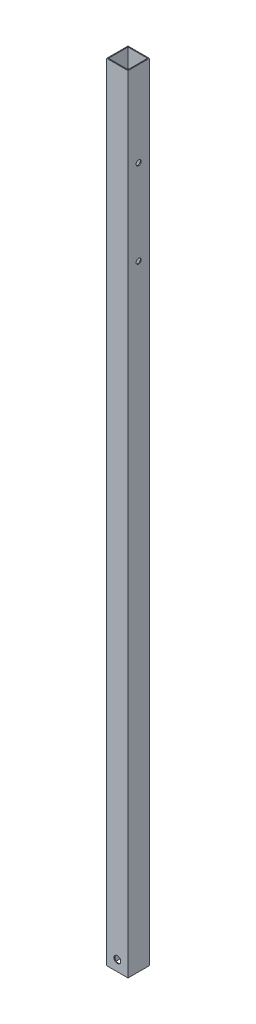
ISO-10303-21;
HEADER;
FILE_DESCRIPTION(('STEP AP214'),'2;1');
FILE_NAME('part.step','',(''),(''),'','','');
FILE_SCHEMA(('AUTOMOTIVE_DESIGN { 1 0 10303 214 1 1 1 1 }'));
ENDSEC;
DATA;
#1=APPLICATION_CONTEXT('core data for automotive mechanical design processes');
#2=APPLICATION_PROTOCOL_DEFINITION('international standard','automotive_design',2000,#1);
#3=PRODUCT_CONTEXT('',#1,'mechanical');
#4=PRODUCT('Part','Part','',(#3));
#5=PRODUCT_RELATED_PRODUCT_CATEGORY('part','',(#4));
#6=PRODUCT_DEFINITION_FORMATION('','',#4);
#7=PRODUCT_DEFINITION_CONTEXT('part definition',#1,'design');
#8=PRODUCT_DEFINITION('design','',#6,#7);
#9=PRODUCT_DEFINITION_SHAPE('','',#8);
#10=(LENGTH_UNIT() NAMED_UNIT(*) SI_UNIT(.MILLI.,.METRE.));
#11=(NAMED_UNIT(*) PLANE_ANGLE_UNIT() SI_UNIT($,.RADIAN.));
#12=(NAMED_UNIT(*) SI_UNIT($,.STERADIAN.) SOLID_ANGLE_UNIT());
#13=UNCERTAINTY_MEASURE_WITH_UNIT(LENGTH_MEASURE(1.E-05),#10,'distance_accuracy_value','');
#14=(GEOMETRIC_REPRESENTATION_CONTEXT(3) GLOBAL_UNCERTAINTY_ASSIGNED_CONTEXT((#13)) GLOBAL_UNIT_ASSIGNED_CONTEXT((#10,
#11,#12)) REPRESENTATION_CONTEXT('',''));
#15=CARTESIAN_POINT('',(0.,0.,0.));
#16=DIRECTION('',(0.,0.,1.));
#17=DIRECTION('',(1.,0.,0.));
#18=AXIS2_PLACEMENT_3D('',#15,#16,#17);
#19=CARTESIAN_POINT('',(0.,922.5,0.));
#20=DIRECTION('',(0.,-1.,0.));
#21=DIRECTION('',(0.,0.,-1.));
#22=AXIS2_PLACEMENT_3D('',#19,#20,#21);
#23=PLANE('',#22);
#24=DIRECTION('',(0.,0.,-1.));
#25=VECTOR('',#24,1.);
#26=CARTESIAN_POINT('',(12.5,922.5,12.5));
#27=LINE('',#26,#25);
#28=CARTESIAN_POINT('',(12.5,922.5,12.5));
#29=VERTEX_POINT('',#28);
#30=CARTESIAN_POINT('',(12.5,922.5,-12.5));
#31=VERTEX_POINT('',#30);
#32=EDGE_CURVE('E141',#29,#31,#27,.T.);
#33=ORIENTED_EDGE('',*,*,#32,.T.);
#34=DIRECTION('',(-1.,0.,0.));
#35=VECTOR('',#34,1.);
#36=CARTESIAN_POINT('',(-12.5,922.5,-12.5));
#37=LINE('',#36,#35);
#38=CARTESIAN_POINT('',(-12.5,922.5,-12.5));
#39=VERTEX_POINT('',#38);
#40=EDGE_CURVE('E144',#31,#39,#37,.T.);
#41=ORIENTED_EDGE('',*,*,#40,.T.);
#42=DIRECTION('',(0.,0.,1.));
#43=VECTOR('',#42,1.);
#44=CARTESIAN_POINT('',(-12.5,922.5,12.5));
#45=LINE('',#44,#43);
#46=CARTESIAN_POINT('',(-12.5,922.5,12.5));
#47=VERTEX_POINT('',#46);
#48=EDGE_CURVE('E147',#39,#47,#45,.T.);
#49=ORIENTED_EDGE('',*,*,#48,.T.);
#50=DIRECTION('',(1.,0.,0.));
#51=VECTOR('',#50,1.);
#52=CARTESIAN_POINT('',(-12.5,922.5,12.5));
#53=LINE('',#52,#51);
#54=EDGE_CURVE('E149',#47,#29,#53,.T.);
#55=ORIENTED_EDGE('',*,*,#54,.T.);
#56=EDGE_LOOP('',(#33,#41,#49,#55));
#57=FACE_BOUND('',#56,.T.);
#58=DIRECTION('',(0.,0.,1.));
#59=VECTOR('',#58,1.);
#60=CARTESIAN_POINT('',(-11.5,922.5,11.5));
#61=LINE('',#60,#59);
#62=CARTESIAN_POINT('',(-11.5,922.5,-11.5));
#63=VERTEX_POINT('',#62);
#64=CARTESIAN_POINT('',(-11.5,922.5,11.5));
#65=VERTEX_POINT('',#64);
#66=EDGE_CURVE('E103',#63,#65,#61,.T.);
#67=ORIENTED_EDGE('',*,*,#66,.F.);
#68=DIRECTION('',(-1.,0.,0.));
#69=VECTOR('',#68,1.);
#70=CARTESIAN_POINT('',(-11.5,922.5,-11.5));
#71=LINE('',#70,#69);
#72=CARTESIAN_POINT('',(11.5,922.5,-11.5));
#73=VERTEX_POINT('',#72);
#74=EDGE_CURVE('E125',#73,#63,#71,.T.);
#75=ORIENTED_EDGE('',*,*,#74,.F.);
#76=DIRECTION('',(0.,0.,-1.));
#77=VECTOR('',#76,1.);
#78=CARTESIAN_POINT('',(11.5,922.5,11.5));
#79=LINE('',#78,#77);
#80=CARTESIAN_POINT('',(11.5,922.5,11.5));
#81=VERTEX_POINT('',#80);
#82=EDGE_CURVE('E123',#81,#73,#79,.T.);
#83=ORIENTED_EDGE('',*,*,#82,.F.);
#84=DIRECTION('',(1.,0.,0.));
#85=VECTOR('',#84,1.);
#86=CARTESIAN_POINT('',(-11.5,922.5,11.5));
#87=LINE('',#86,#85);
#88=EDGE_CURVE('E111',#65,#81,#87,.T.);
#89=ORIENTED_EDGE('',*,*,#88,.F.);
#90=EDGE_LOOP('',(#67,#75,#83,#89));
#91=FACE_BOUND('',#90,.T.);
#92=ADVANCED_FACE('F36',(#57,#91),#23,.F.);
#93=CARTESIAN_POINT('',(0.,0.,0.));
#94=DIRECTION('',(0.,-1.,0.));
#95=DIRECTION('',(0.,0.,-1.));
#96=AXIS2_PLACEMENT_3D('',#93,#94,#95);
#97=PLANE('',#96);
#98=DIRECTION('',(0.,0.,-1.));
#99=VECTOR('',#98,1.);
#100=CARTESIAN_POINT('',(12.5,0.,12.5));
#101=LINE('',#100,#99);
#102=CARTESIAN_POINT('',(12.5,0.,12.5));
#103=VERTEX_POINT('',#102);
#104=CARTESIAN_POINT('',(12.5,0.,-12.5));
#105=VERTEX_POINT('',#104);
#106=EDGE_CURVE('E119',#103,#105,#101,.T.);
#107=ORIENTED_EDGE('',*,*,#106,.F.);
#108=DIRECTION('',(1.,0.,0.));
#109=VECTOR('',#108,1.);
#110=CARTESIAN_POINT('',(-12.5,0.,12.5));
#111=LINE('',#110,#109);
#112=CARTESIAN_POINT('',(-12.5,0.,12.5));
#113=VERTEX_POINT('',#112);
#114=EDGE_CURVE('E145',#113,#103,#111,.T.);
#115=ORIENTED_EDGE('',*,*,#114,.F.);
#116=DIRECTION('',(0.,0.,1.));
#117=VECTOR('',#116,1.);
#118=CARTESIAN_POINT('',(-12.5,0.,12.5));
#119=LINE('',#118,#117);
#120=CARTESIAN_POINT('',(-12.5,0.,-12.5));
#121=VERTEX_POINT('',#120);
#122=EDGE_CURVE('E156',#121,#113,#119,.T.);
#123=ORIENTED_EDGE('',*,*,#122,.F.);
#124=DIRECTION('',(-1.,0.,0.));
#125=VECTOR('',#124,1.);
#126=CARTESIAN_POINT('',(-12.5,0.,-12.5));
#127=LINE('',#126,#125);
#128=EDGE_CURVE('E154',#105,#121,#127,.T.);
#129=ORIENTED_EDGE('',*,*,#128,.F.);
#130=EDGE_LOOP('',(#107,#115,#123,#129));
#131=FACE_BOUND('',#130,.T.);
#132=DIRECTION('',(-1.,0.,0.));
#133=VECTOR('',#132,1.);
#134=CARTESIAN_POINT('',(-11.5,0.,-11.5));
#135=LINE('',#134,#133);
#136=CARTESIAN_POINT('',(11.5,0.,-11.5));
#137=VERTEX_POINT('',#136);
#138=CARTESIAN_POINT('',(-11.5,0.,-11.5));
#139=VERTEX_POINT('',#138);
#140=EDGE_CURVE('E112',#137,#139,#135,.T.);
#141=ORIENTED_EDGE('',*,*,#140,.T.);
#142=DIRECTION('',(0.,0.,1.));
#143=VECTOR('',#142,1.);
#144=CARTESIAN_POINT('',(-11.5,0.,11.5));
#145=LINE('',#144,#143);
#146=CARTESIAN_POINT('',(-11.5,0.,11.5));
#147=VERTEX_POINT('',#146);
#148=EDGE_CURVE('E61',#139,#147,#145,.T.);
#149=ORIENTED_EDGE('',*,*,#148,.T.);
#150=DIRECTION('',(1.,0.,0.));
#151=VECTOR('',#150,1.);
#152=CARTESIAN_POINT('',(-11.5,0.,11.5));
#153=LINE('',#152,#151);
#154=CARTESIAN_POINT('',(11.5,0.,11.5));
#155=VERTEX_POINT('',#154);
#156=EDGE_CURVE('E118',#147,#155,#153,.T.);
#157=ORIENTED_EDGE('',*,*,#156,.T.);
#158=DIRECTION('',(0.,0.,-1.));
#159=VECTOR('',#158,1.);
#160=CARTESIAN_POINT('',(11.5,0.,11.5));
#161=LINE('',#160,#159);
#162=EDGE_CURVE('E133',#155,#137,#161,.T.);
#163=ORIENTED_EDGE('',*,*,#162,.T.);
#164=EDGE_LOOP('',(#141,#149,#157,#163));
#165=FACE_BOUND('',#164,.T.);
#166=ADVANCED_FACE('F214',(#131,#165),#97,.T.);
#167=CARTESIAN_POINT('',(12.5,922.5,12.5));
#168=DIRECTION('',(-1.,0.,0.));
#169=DIRECTION('',(0.,0.,1.));
#170=AXIS2_PLACEMENT_3D('',#167,#168,#169);
#171=PLANE('',#170);
#172=CARTESIAN_POINT('',(12.5,822.5,0.));
#173=DIRECTION('',(1.,0.,0.));
#174=DIRECTION('',(0.,0.,-1.));
#175=AXIS2_PLACEMENT_3D('',#172,#173,#174);
#176=CIRCLE('',#175,3.);
#177=CARTESIAN_POINT('',(12.5,822.5,-3.));
#178=VERTEX_POINT('',#177);
#179=EDGE_CURVE('E187',#178,#178,#176,.T.);
#180=ORIENTED_EDGE('',*,*,#179,.F.);
#181=EDGE_LOOP('',(#180));
#182=FACE_BOUND('',#181,.T.);
#183=CARTESIAN_POINT('',(12.5,722.5,0.));
#184=DIRECTION('',(1.,0.,0.));
#185=DIRECTION('',(0.,0.,-1.));
#186=AXIS2_PLACEMENT_3D('',#183,#184,#185);
#187=CIRCLE('',#186,3.);
#188=CARTESIAN_POINT('',(12.5,722.5,-3.));
#189=VERTEX_POINT('',#188);
#190=EDGE_CURVE('E183',#189,#189,#187,.T.);
#191=ORIENTED_EDGE('',*,*,#190,.F.);
#192=EDGE_LOOP('',(#191));
#193=FACE_BOUND('',#192,.T.);
#194=ORIENTED_EDGE('',*,*,#106,.T.);
#195=DIRECTION('',(0.,-1.,0.));
#196=VECTOR('',#195,1.);
#197=CARTESIAN_POINT('',(12.5,922.5,-12.5));
#198=LINE('',#197,#196);
#199=EDGE_CURVE('E11',#31,#105,#198,.T.);
#200=ORIENTED_EDGE('',*,*,#199,.F.);
#201=ORIENTED_EDGE('',*,*,#32,.F.);
#202=DIRECTION('',(0.,-1.,0.));
#203=VECTOR('',#202,1.);
#204=CARTESIAN_POINT('',(12.5,922.5,12.5));
#205=LINE('',#204,#203);
#206=EDGE_CURVE('E151',#29,#103,#205,.T.);
#207=ORIENTED_EDGE('',*,*,#206,.T.);
#208=EDGE_LOOP('',(#194,#200,#201,#207));
#209=FACE_BOUND('',#208,.T.);
#210=ADVANCED_FACE('F38',(#182,#193,#209),#171,.F.);
#211=CARTESIAN_POINT('',(-12.5,922.5,-12.5));
#212=DIRECTION('',(0.,0.,1.));
#213=DIRECTION('',(1.,0.,0.));
#214=AXIS2_PLACEMENT_3D('',#211,#212,#213);
#215=PLANE('',#214);
#216=CARTESIAN_POINT('',(0.,12.5,-12.5));
#217=DIRECTION('',(0.,0.,1.));
#218=DIRECTION('',(1.,0.,0.));
#219=AXIS2_PLACEMENT_3D('',#216,#217,#218);
#220=CIRCLE('',#219,4.);
#221=CARTESIAN_POINT('',(4.,12.5,-12.5));
#222=VERTEX_POINT('',#221);
#223=EDGE_CURVE('E197',#222,#222,#220,.T.);
#224=ORIENTED_EDGE('',*,*,#223,.T.);
#225=EDGE_LOOP('',(#224));
#226=FACE_BOUND('',#225,.T.);
#227=ORIENTED_EDGE('',*,*,#128,.T.);
#228=DIRECTION('',(0.,-1.,0.));
#229=VECTOR('',#228,1.);
#230=CARTESIAN_POINT('',(-12.5,922.5,-12.5));
#231=LINE('',#230,#229);
#232=EDGE_CURVE('E45',#39,#121,#231,.T.);
#233=ORIENTED_EDGE('',*,*,#232,.F.);
#234=ORIENTED_EDGE('',*,*,#40,.F.);
#235=ORIENTED_EDGE('',*,*,#199,.T.);
#236=EDGE_LOOP('',(#227,#233,#234,#235));
#237=FACE_BOUND('',#236,.T.);
#238=ADVANCED_FACE('F243',(#226,#237),#215,.F.);
#239=CARTESIAN_POINT('',(-12.5,922.5,12.5));
#240=DIRECTION('',(1.,0.,0.));
#241=DIRECTION('',(0.,0.,-1.));
#242=AXIS2_PLACEMENT_3D('',#239,#240,#241);
#243=PLANE('',#242);
#244=CARTESIAN_POINT('',(-12.5,822.5,0.));
#245=DIRECTION('',(1.,0.,0.));
#246=DIRECTION('',(0.,0.,-1.));
#247=AXIS2_PLACEMENT_3D('',#244,#245,#246);
#248=CIRCLE('',#247,3.);
#249=CARTESIAN_POINT('',(-12.5,822.5,-3.));
#250=VERTEX_POINT('',#249);
#251=EDGE_CURVE('E169',#250,#250,#248,.T.);
#252=ORIENTED_EDGE('',*,*,#251,.T.);
#253=EDGE_LOOP('',(#252));
#254=FACE_BOUND('',#253,.T.);
#255=CARTESIAN_POINT('',(-12.5,722.5,0.));
#256=DIRECTION('',(1.,0.,0.));
#257=DIRECTION('',(0.,0.,-1.));
#258=AXIS2_PLACEMENT_3D('',#255,#256,#257);
#259=CIRCLE('',#258,3.);
#260=CARTESIAN_POINT('',(-12.5,722.5,-3.));
#261=VERTEX_POINT('',#260);
#262=EDGE_CURVE('E180',#261,#261,#259,.T.);
#263=ORIENTED_EDGE('',*,*,#262,.T.);
#264=EDGE_LOOP('',(#263));
#265=FACE_BOUND('',#264,.T.);
#266=ORIENTED_EDGE('',*,*,#122,.T.);
#267=DIRECTION('',(0.,-1.,0.));
#268=VECTOR('',#267,1.);
#269=CARTESIAN_POINT('',(-12.5,922.5,12.5));
#270=LINE('',#269,#268);
#271=EDGE_CURVE('E161',#47,#113,#270,.T.);
#272=ORIENTED_EDGE('',*,*,#271,.F.);
#273=ORIENTED_EDGE('',*,*,#48,.F.);
#274=ORIENTED_EDGE('',*,*,#232,.T.);
#275=EDGE_LOOP('',(#266,#272,#273,#274));
#276=FACE_BOUND('',#275,.T.);
#277=ADVANCED_FACE('F240',(#254,#265,#276),#243,.F.);
#278=CARTESIAN_POINT('',(-12.5,922.5,12.5));
#279=DIRECTION('',(0.,0.,-1.));
#280=DIRECTION('',(-1.,0.,0.));
#281=AXIS2_PLACEMENT_3D('',#278,#279,#280);
#282=PLANE('',#281);
#283=CARTESIAN_POINT('',(0.,12.5,12.5));
#284=DIRECTION('',(0.,0.,1.));
#285=DIRECTION('',(1.,0.,0.));
#286=AXIS2_PLACEMENT_3D('',#283,#284,#285);
#287=CIRCLE('',#286,4.);
#288=CARTESIAN_POINT('',(4.,12.5,12.5));
#289=VERTEX_POINT('',#288);
#290=EDGE_CURVE('E194',#289,#289,#287,.T.);
#291=ORIENTED_EDGE('',*,*,#290,.F.);
#292=EDGE_LOOP('',(#291));
#293=FACE_BOUND('',#292,.T.);
#294=ORIENTED_EDGE('',*,*,#114,.T.);
#295=ORIENTED_EDGE('',*,*,#206,.F.);
#296=ORIENTED_EDGE('',*,*,#54,.F.);
#297=ORIENTED_EDGE('',*,*,#271,.T.);
#298=EDGE_LOOP('',(#294,#295,#296,#297));
#299=FACE_BOUND('',#298,.T.);
#300=ADVANCED_FACE('F237',(#293,#299),#282,.F.);
#301=CARTESIAN_POINT('',(-11.5,922.5,11.5));
#302=DIRECTION('',(1.,0.,0.));
#303=DIRECTION('',(0.,0.,-1.));
#304=AXIS2_PLACEMENT_3D('',#301,#302,#303);
#305=PLANE('',#304);
#306=CARTESIAN_POINT('',(-11.5,822.5,0.));
#307=DIRECTION('',(1.,0.,0.));
#308=DIRECTION('',(0.,0.,-1.));
#309=AXIS2_PLACEMENT_3D('',#306,#307,#308);
#310=CIRCLE('',#309,3.);
#311=CARTESIAN_POINT('',(-11.5,822.5,-3.));
#312=VERTEX_POINT('',#311);
#313=EDGE_CURVE('E131',#312,#312,#310,.T.);
#314=ORIENTED_EDGE('',*,*,#313,.F.);
#315=EDGE_LOOP('',(#314));
#316=FACE_BOUND('',#315,.T.);
#317=CARTESIAN_POINT('',(-11.5,722.5,0.));
#318=DIRECTION('',(1.,0.,0.));
#319=DIRECTION('',(0.,0.,-1.));
#320=AXIS2_PLACEMENT_3D('',#317,#318,#319);
#321=CIRCLE('',#320,3.);
#322=CARTESIAN_POINT('',(-11.5,722.5,-3.));
#323=VERTEX_POINT('',#322);
#324=EDGE_CURVE('E168',#323,#323,#321,.T.);
#325=ORIENTED_EDGE('',*,*,#324,.F.);
#326=EDGE_LOOP('',(#325));
#327=FACE_BOUND('',#326,.T.);
#328=ORIENTED_EDGE('',*,*,#148,.F.);
#329=DIRECTION('',(0.,-1.,0.));
#330=VECTOR('',#329,1.);
#331=CARTESIAN_POINT('',(-11.5,922.5,-11.5));
#332=LINE('',#331,#330);
#333=EDGE_CURVE('E107',#63,#139,#332,.T.);
#334=ORIENTED_EDGE('',*,*,#333,.F.);
#335=ORIENTED_EDGE('',*,*,#66,.T.);
#336=DIRECTION('',(0.,-1.,0.));
#337=VECTOR('',#336,1.);
#338=CARTESIAN_POINT('',(-11.5,922.5,11.5));
#339=LINE('',#338,#337);
#340=EDGE_CURVE('E106',#65,#147,#339,.T.);
#341=ORIENTED_EDGE('',*,*,#340,.T.);
#342=EDGE_LOOP('',(#328,#334,#335,#341));
#343=FACE_BOUND('',#342,.T.);
#344=ADVANCED_FACE('F105',(#316,#327,#343),#305,.T.);
#345=CARTESIAN_POINT('',(-11.5,922.5,11.5));
#346=DIRECTION('',(0.,0.,-1.));
#347=DIRECTION('',(-1.,0.,0.));
#348=AXIS2_PLACEMENT_3D('',#345,#346,#347);
#349=PLANE('',#348);
#350=CARTESIAN_POINT('',(0.,12.5,11.5));
#351=DIRECTION('',(0.,0.,-1.));
#352=DIRECTION('',(-1.,0.,0.));
#353=AXIS2_PLACEMENT_3D('',#350,#351,#352);
#354=CIRCLE('',#353,4.);
#355=CARTESIAN_POINT('',(-4.,12.5,11.5));
#356=VERTEX_POINT('',#355);
#357=EDGE_CURVE('E184',#356,#356,#354,.T.);
#358=ORIENTED_EDGE('',*,*,#357,.F.);
#359=EDGE_LOOP('',(#358));
#360=FACE_BOUND('',#359,.T.);
#361=ORIENTED_EDGE('',*,*,#156,.F.);
#362=ORIENTED_EDGE('',*,*,#340,.F.);
#363=ORIENTED_EDGE('',*,*,#88,.T.);
#364=DIRECTION('',(0.,-1.,0.));
#365=VECTOR('',#364,1.);
#366=CARTESIAN_POINT('',(11.5,922.5,11.5));
#367=LINE('',#366,#365);
#368=EDGE_CURVE('E120',#81,#155,#367,.T.);
#369=ORIENTED_EDGE('',*,*,#368,.T.);
#370=EDGE_LOOP('',(#361,#362,#363,#369));
#371=FACE_BOUND('',#370,.T.);
#372=ADVANCED_FACE('F115',(#360,#371),#349,.T.);
#373=CARTESIAN_POINT('',(11.5,922.5,11.5));
#374=DIRECTION('',(-1.,0.,0.));
#375=DIRECTION('',(0.,0.,1.));
#376=AXIS2_PLACEMENT_3D('',#373,#374,#375);
#377=PLANE('',#376);
#378=CARTESIAN_POINT('',(11.5,822.5,0.));
#379=DIRECTION('',(-1.,0.,0.));
#380=DIRECTION('',(0.,0.,1.));
#381=AXIS2_PLACEMENT_3D('',#378,#379,#380);
#382=CIRCLE('',#381,3.);
#383=CARTESIAN_POINT('',(11.5,822.5,3.));
#384=VERTEX_POINT('',#383);
#385=EDGE_CURVE('E170',#384,#384,#382,.T.);
#386=ORIENTED_EDGE('',*,*,#385,.F.);
#387=EDGE_LOOP('',(#386));
#388=FACE_BOUND('',#387,.T.);
#389=CARTESIAN_POINT('',(11.5,722.5,0.));
#390=DIRECTION('',(-1.,0.,0.));
#391=DIRECTION('',(0.,0.,1.));
#392=AXIS2_PLACEMENT_3D('',#389,#390,#391);
#393=CIRCLE('',#392,3.);
#394=CARTESIAN_POINT('',(11.5,722.5,3.));
#395=VERTEX_POINT('',#394);
#396=EDGE_CURVE('E166',#395,#395,#393,.T.);
#397=ORIENTED_EDGE('',*,*,#396,.F.);
#398=EDGE_LOOP('',(#397));
#399=FACE_BOUND('',#398,.T.);
#400=ORIENTED_EDGE('',*,*,#162,.F.);
#401=ORIENTED_EDGE('',*,*,#368,.F.);
#402=ORIENTED_EDGE('',*,*,#82,.T.);
#403=DIRECTION('',(0.,-1.,0.));
#404=VECTOR('',#403,1.);
#405=CARTESIAN_POINT('',(11.5,922.5,-11.5));
#406=LINE('',#405,#404);
#407=EDGE_CURVE('E53',#73,#137,#406,.T.);
#408=ORIENTED_EDGE('',*,*,#407,.T.);
#409=EDGE_LOOP('',(#400,#401,#402,#408));
#410=FACE_BOUND('',#409,.T.);
#411=ADVANCED_FACE('F210',(#388,#399,#410),#377,.T.);
#412=CARTESIAN_POINT('',(-11.5,922.5,-11.5));
#413=DIRECTION('',(0.,0.,1.));
#414=DIRECTION('',(1.,0.,0.));
#415=AXIS2_PLACEMENT_3D('',#412,#413,#414);
#416=PLANE('',#415);
#417=CARTESIAN_POINT('',(0.,12.5,-11.5));
#418=DIRECTION('',(0.,0.,1.));
#419=DIRECTION('',(1.,0.,0.));
#420=AXIS2_PLACEMENT_3D('',#417,#418,#419);
#421=CIRCLE('',#420,4.);
#422=CARTESIAN_POINT('',(4.,12.5,-11.5));
#423=VERTEX_POINT('',#422);
#424=EDGE_CURVE('E40',#423,#423,#421,.T.);
#425=ORIENTED_EDGE('',*,*,#424,.F.);
#426=EDGE_LOOP('',(#425));
#427=FACE_BOUND('',#426,.T.);
#428=ORIENTED_EDGE('',*,*,#140,.F.);
#429=ORIENTED_EDGE('',*,*,#407,.F.);
#430=ORIENTED_EDGE('',*,*,#74,.T.);
#431=ORIENTED_EDGE('',*,*,#333,.T.);
#432=EDGE_LOOP('',(#428,#429,#430,#431));
#433=FACE_BOUND('',#432,.T.);
#434=ADVANCED_FACE('F207',(#427,#433),#416,.T.);
#435=CARTESIAN_POINT('',(-12.5,722.5,0.));
#436=DIRECTION('',(1.,0.,0.));
#437=DIRECTION('',(0.,0.,-1.));
#438=AXIS2_PLACEMENT_3D('',#435,#436,#437);
#439=CYLINDRICAL_SURFACE('',#438,3.);
#440=ORIENTED_EDGE('',*,*,#396,.T.);
#441=EDGE_LOOP('',(#440));
#442=FACE_BOUND('',#441,.T.);
#443=ORIENTED_EDGE('',*,*,#190,.T.);
#444=EDGE_LOOP('',(#443));
#445=FACE_BOUND('',#444,.T.);
#446=ADVANCED_FACE('F209',(#442,#445),#439,.F.);
#447=CARTESIAN_POINT('',(-12.5,822.5,0.));
#448=DIRECTION('',(1.,0.,0.));
#449=DIRECTION('',(0.,0.,-1.));
#450=AXIS2_PLACEMENT_3D('',#447,#448,#449);
#451=CYLINDRICAL_SURFACE('',#450,3.);
#452=ORIENTED_EDGE('',*,*,#385,.T.);
#453=EDGE_LOOP('',(#452));
#454=FACE_BOUND('',#453,.T.);
#455=ORIENTED_EDGE('',*,*,#179,.T.);
#456=EDGE_LOOP('',(#455));
#457=FACE_BOUND('',#456,.T.);
#458=ADVANCED_FACE('F273',(#454,#457),#451,.F.);
#459=ORIENTED_EDGE('',*,*,#324,.T.);
#460=EDGE_LOOP('',(#459));
#461=FACE_BOUND('',#460,.T.);
#462=ORIENTED_EDGE('',*,*,#262,.F.);
#463=EDGE_LOOP('',(#462));
#464=FACE_BOUND('',#463,.T.);
#465=ADVANCED_FACE('F276',(#461,#464),#439,.F.);
#466=ORIENTED_EDGE('',*,*,#313,.T.);
#467=EDGE_LOOP('',(#466));
#468=FACE_BOUND('',#467,.T.);
#469=ORIENTED_EDGE('',*,*,#251,.F.);
#470=EDGE_LOOP('',(#469));
#471=FACE_BOUND('',#470,.T.);
#472=ADVANCED_FACE('F281',(#468,#471),#451,.F.);
#473=CARTESIAN_POINT('',(0.,12.5,-12.5));
#474=DIRECTION('',(0.,0.,1.));
#475=DIRECTION('',(1.,0.,0.));
#476=AXIS2_PLACEMENT_3D('',#473,#474,#475);
#477=CYLINDRICAL_SURFACE('',#476,4.);
#478=ORIENTED_EDGE('',*,*,#424,.T.);
#479=EDGE_LOOP('',(#478));
#480=FACE_BOUND('',#479,.T.);
#481=ORIENTED_EDGE('',*,*,#223,.F.);
#482=EDGE_LOOP('',(#481));
#483=FACE_BOUND('',#482,.T.);
#484=ADVANCED_FACE('F204',(#480,#483),#477,.F.);
#485=ORIENTED_EDGE('',*,*,#357,.T.);
#486=EDGE_LOOP('',(#485));
#487=FACE_BOUND('',#486,.T.);
#488=ORIENTED_EDGE('',*,*,#290,.T.);
#489=EDGE_LOOP('',(#488));
#490=FACE_BOUND('',#489,.T.);
#491=ADVANCED_FACE('F292',(#487,#490),#477,.F.);
#492=CLOSED_SHELL('',(#92,#166,#210,#238,#277,#300,#344,#372,#411,#434,#446,#458,#465,#472,#484,#491));
#493=MANIFOLD_SOLID_BREP('B2',#492);
#494=ADVANCED_BREP_SHAPE_REPRESENTATION('',(#18,#493),#14);
#495=SHAPE_DEFINITION_REPRESENTATION(#9,#494);
ENDSEC;
END-ISO-10303-21;
